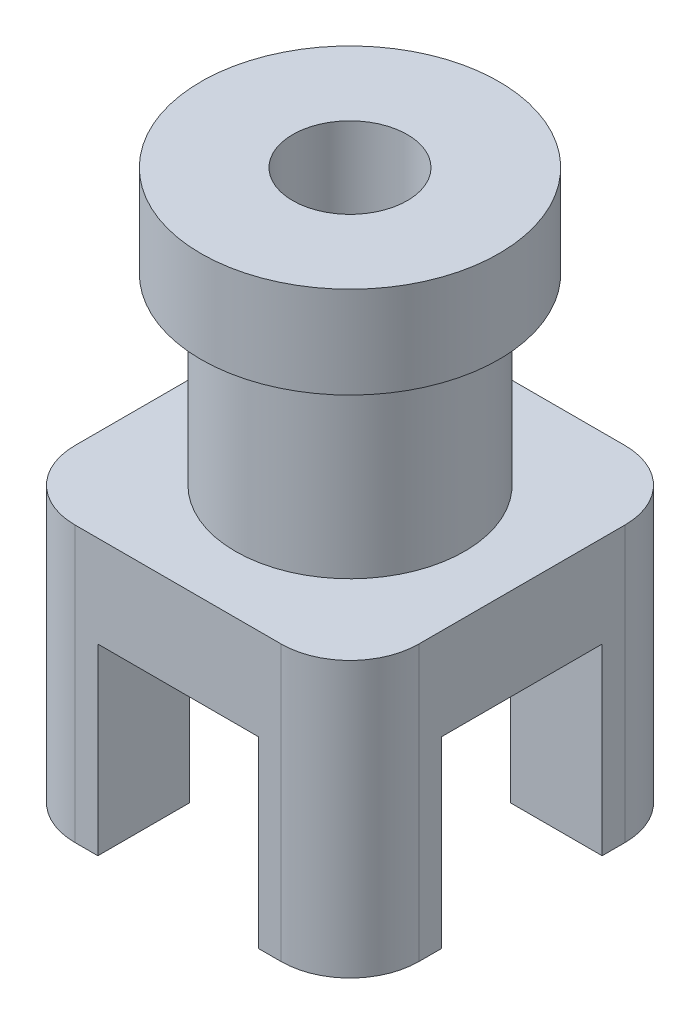
ISO-10303-21;
HEADER;
FILE_DESCRIPTION(('STEP AP214'),'2;1');
FILE_NAME('part.step','',(''),(''),'','','');
FILE_SCHEMA(('AUTOMOTIVE_DESIGN { 1 0 10303 214 1 1 1 1 }'));
ENDSEC;
DATA;
#1=APPLICATION_CONTEXT('core data for automotive mechanical design processes');
#2=APPLICATION_PROTOCOL_DEFINITION('international standard','automotive_design',2000,#1);
#3=PRODUCT_CONTEXT('',#1,'mechanical');
#4=PRODUCT('Part','Part','',(#3));
#5=PRODUCT_RELATED_PRODUCT_CATEGORY('part','',(#4));
#6=PRODUCT_DEFINITION_FORMATION('','',#4);
#7=PRODUCT_DEFINITION_CONTEXT('part definition',#1,'design');
#8=PRODUCT_DEFINITION('design','',#6,#7);
#9=PRODUCT_DEFINITION_SHAPE('','',#8);
#10=(LENGTH_UNIT() NAMED_UNIT(*) SI_UNIT(.MILLI.,.METRE.));
#11=(NAMED_UNIT(*) PLANE_ANGLE_UNIT() SI_UNIT($,.RADIAN.));
#12=(NAMED_UNIT(*) SI_UNIT($,.STERADIAN.) SOLID_ANGLE_UNIT());
#13=UNCERTAINTY_MEASURE_WITH_UNIT(LENGTH_MEASURE(1.E-05),#10,'distance_accuracy_value','');
#14=(GEOMETRIC_REPRESENTATION_CONTEXT(3) GLOBAL_UNCERTAINTY_ASSIGNED_CONTEXT((#13)) GLOBAL_UNIT_ASSIGNED_CONTEXT((#10,
#11,#12)) REPRESENTATION_CONTEXT('',''));
#15=CARTESIAN_POINT('',(0.,0.,0.));
#16=DIRECTION('',(0.,0.,1.));
#17=DIRECTION('',(1.,0.,0.));
#18=AXIS2_PLACEMENT_3D('',#15,#16,#17);
#19=CARTESIAN_POINT('',(0.,160.,0.));
#20=DIRECTION('',(0.,-1.,0.));
#21=DIRECTION('',(0.,0.,-1.));
#22=AXIS2_PLACEMENT_3D('',#19,#20,#21);
#23=CYLINDRICAL_SURFACE('',#22,50.);
#24=CARTESIAN_POINT('',(0.,40.,0.));
#25=DIRECTION('',(0.,1.,0.));
#26=DIRECTION('',(0.,0.,1.));
#27=AXIS2_PLACEMENT_3D('',#24,#25,#26);
#28=CIRCLE('',#27,50.);
#29=CARTESIAN_POINT('',(0.,40.,50.));
#30=VERTEX_POINT('',#29);
#31=EDGE_CURVE('E322',#30,#30,#28,.T.);
#32=ORIENTED_EDGE('',*,*,#31,.T.);
#33=EDGE_LOOP('',(#32));
#34=FACE_BOUND('',#33,.T.);
#35=CARTESIAN_POINT('',(0.,120.,0.));
#36=DIRECTION('',(0.,1.,0.));
#37=DIRECTION('',(0.,0.,1.));
#38=AXIS2_PLACEMENT_3D('',#35,#36,#37);
#39=CIRCLE('',#38,50.);
#40=CARTESIAN_POINT('',(0.,120.,50.));
#41=VERTEX_POINT('',#40);
#42=EDGE_CURVE('E11',#41,#41,#39,.T.);
#43=ORIENTED_EDGE('',*,*,#42,.F.);
#44=EDGE_LOOP('',(#43));
#45=FACE_BOUND('',#44,.T.);
#46=ADVANCED_FACE('F39',(#34,#45),#23,.T.);
#47=CARTESIAN_POINT('',(0.,-61.0000000000001,0.));
#48=DIRECTION('',(0.,1.,0.));
#49=DIRECTION('',(0.,0.,1.));
#50=AXIS2_PLACEMENT_3D('',#47,#48,#49);
#51=CYLINDRICAL_SURFACE('',#50,25.);
#52=CARTESIAN_POINT('',(0.,160.,0.));
#53=DIRECTION('',(0.,1.,0.));
#54=DIRECTION('',(0.,0.,1.));
#55=AXIS2_PLACEMENT_3D('',#52,#53,#54);
#56=CIRCLE('',#55,25.);
#57=CARTESIAN_POINT('',(0.,160.,25.));
#58=VERTEX_POINT('',#57);
#59=EDGE_CURVE('E727',#58,#58,#56,.T.);
#60=ORIENTED_EDGE('',*,*,#59,.T.);
#61=EDGE_LOOP('',(#60));
#62=FACE_BOUND('',#61,.T.);
#63=CARTESIAN_POINT('',(0.,0.,0.));
#64=DIRECTION('',(0.,-1.,0.));
#65=DIRECTION('',(0.,0.,-1.));
#66=AXIS2_PLACEMENT_3D('',#63,#64,#65);
#67=CIRCLE('',#66,25.);
#68=CARTESIAN_POINT('',(0.,0.,-25.));
#69=VERTEX_POINT('',#68);
#70=EDGE_CURVE('E710',#69,#69,#67,.T.);
#71=ORIENTED_EDGE('',*,*,#70,.T.);
#72=EDGE_LOOP('',(#71));
#73=FACE_BOUND('',#72,.T.);
#74=ADVANCED_FACE('F420',(#62,#73),#51,.F.);
#75=CARTESIAN_POINT('',(0.,0.,0.));
#76=DIRECTION('',(0.,-1.,0.));
#77=DIRECTION('',(0.,0.,-1.));
#78=AXIS2_PLACEMENT_3D('',#75,#76,#77);
#79=PLANE('',#78);
#80=ORIENTED_EDGE('',*,*,#70,.F.);
#81=EDGE_LOOP('',(#80));
#82=FACE_BOUND('',#81,.T.);
#83=DIRECTION('',(0.,0.,-1.));
#84=VECTOR('',#83,1.);
#85=CARTESIAN_POINT('',(35.,0.,-75.));
#86=LINE('',#85,#84);
#87=CARTESIAN_POINT('',(35.,0.,-35.));
#88=VERTEX_POINT('',#87);
#89=CARTESIAN_POINT('',(35.,0.,-75.));
#90=VERTEX_POINT('',#89);
#91=EDGE_CURVE('E188',#88,#90,#86,.T.);
#92=ORIENTED_EDGE('',*,*,#91,.F.);
#93=DIRECTION('',(-1.,0.,0.));
#94=VECTOR('',#93,1.);
#95=CARTESIAN_POINT('',(75.,0.,-35.));
#96=LINE('',#95,#94);
#97=CARTESIAN_POINT('',(75.,0.,-35.));
#98=VERTEX_POINT('',#97);
#99=EDGE_CURVE('E707',#98,#88,#96,.T.);
#100=ORIENTED_EDGE('',*,*,#99,.F.);
#101=DIRECTION('',(0.,0.,-1.));
#102=VECTOR('',#101,1.);
#103=CARTESIAN_POINT('',(75.,0.,-75.));
#104=LINE('',#103,#102);
#105=CARTESIAN_POINT('',(75.,0.,35.));
#106=VERTEX_POINT('',#105);
#107=EDGE_CURVE('E204',#106,#98,#104,.T.);
#108=ORIENTED_EDGE('',*,*,#107,.F.);
#109=DIRECTION('',(1.,0.,0.));
#110=VECTOR('',#109,1.);
#111=CARTESIAN_POINT('',(75.,0.,35.));
#112=LINE('',#111,#110);
#113=CARTESIAN_POINT('',(35.,0.,35.));
#114=VERTEX_POINT('',#113);
#115=EDGE_CURVE('E248',#114,#106,#112,.T.);
#116=ORIENTED_EDGE('',*,*,#115,.F.);
#117=DIRECTION('',(0.,0.,-1.));
#118=VECTOR('',#117,1.);
#119=CARTESIAN_POINT('',(35.,0.,75.));
#120=LINE('',#119,#118);
#121=CARTESIAN_POINT('',(35.,0.,75.));
#122=VERTEX_POINT('',#121);
#123=EDGE_CURVE('E243',#122,#114,#120,.T.);
#124=ORIENTED_EDGE('',*,*,#123,.F.);
#125=DIRECTION('',(1.,0.,0.));
#126=VECTOR('',#125,1.);
#127=CARTESIAN_POINT('',(75.,0.,75.));
#128=LINE('',#127,#126);
#129=CARTESIAN_POINT('',(-35.,0.,75.));
#130=VERTEX_POINT('',#129);
#131=EDGE_CURVE('E325',#130,#122,#128,.T.);
#132=ORIENTED_EDGE('',*,*,#131,.F.);
#133=DIRECTION('',(0.,0.,1.));
#134=VECTOR('',#133,1.);
#135=CARTESIAN_POINT('',(-35.,0.,75.));
#136=LINE('',#135,#134);
#137=CARTESIAN_POINT('',(-35.,0.,35.));
#138=VERTEX_POINT('',#137);
#139=EDGE_CURVE('E276',#138,#130,#136,.T.);
#140=ORIENTED_EDGE('',*,*,#139,.F.);
#141=DIRECTION('',(1.,0.,0.));
#142=VECTOR('',#141,1.);
#143=CARTESIAN_POINT('',(-75.,0.,35.));
#144=LINE('',#143,#142);
#145=CARTESIAN_POINT('',(-75.,0.,35.));
#146=VERTEX_POINT('',#145);
#147=EDGE_CURVE('E271',#146,#138,#144,.T.);
#148=ORIENTED_EDGE('',*,*,#147,.F.);
#149=DIRECTION('',(0.,0.,1.));
#150=VECTOR('',#149,1.);
#151=CARTESIAN_POINT('',(-75.,0.,-75.));
#152=LINE('',#151,#150);
#153=CARTESIAN_POINT('',(-75.,0.,-35.));
#154=VERTEX_POINT('',#153);
#155=EDGE_CURVE('E304',#154,#146,#152,.T.);
#156=ORIENTED_EDGE('',*,*,#155,.F.);
#157=DIRECTION('',(-1.,0.,0.));
#158=VECTOR('',#157,1.);
#159=CARTESIAN_POINT('',(-75.,0.,-35.));
#160=LINE('',#159,#158);
#161=CARTESIAN_POINT('',(-35.,0.,-35.));
#162=VERTEX_POINT('',#161);
#163=EDGE_CURVE('E210',#162,#154,#160,.T.);
#164=ORIENTED_EDGE('',*,*,#163,.F.);
#165=DIRECTION('',(0.,0.,1.));
#166=VECTOR('',#165,1.);
#167=CARTESIAN_POINT('',(-35.,0.,-75.));
#168=LINE('',#167,#166);
#169=CARTESIAN_POINT('',(-35.,0.,-75.));
#170=VERTEX_POINT('',#169);
#171=EDGE_CURVE('E206',#170,#162,#168,.T.);
#172=ORIENTED_EDGE('',*,*,#171,.F.);
#173=DIRECTION('',(-1.,0.,0.));
#174=VECTOR('',#173,1.);
#175=CARTESIAN_POINT('',(75.,0.,-75.));
#176=LINE('',#175,#174);
#177=EDGE_CURVE('E310',#90,#170,#176,.T.);
#178=ORIENTED_EDGE('',*,*,#177,.F.);
#179=EDGE_LOOP('',(#92,#100,#108,#116,#124,#132,#140,#148,#156,#164,#172,#178));
#180=FACE_BOUND('',#179,.T.);
#181=ADVANCED_FACE('F404',(#82,#180),#79,.T.);
#182=CARTESIAN_POINT('',(-75.,40.,-75.));
#183=DIRECTION('',(1.,0.,0.));
#184=DIRECTION('',(0.,0.,-1.));
#185=AXIS2_PLACEMENT_3D('',#182,#183,#184);
#186=PLANE('',#185);
#187=DIRECTION('',(0.,0.,1.));
#188=VECTOR('',#187,1.);
#189=CARTESIAN_POINT('',(-75.,40.,-75.));
#190=LINE('',#189,#188);
#191=CARTESIAN_POINT('',(-75.,40.,-45.));
#192=VERTEX_POINT('',#191);
#193=CARTESIAN_POINT('',(-75.,40.,45.));
#194=VERTEX_POINT('',#193);
#195=EDGE_CURVE('E305',#192,#194,#190,.T.);
#196=ORIENTED_EDGE('',*,*,#195,.F.);
#197=DIRECTION('',(0.,-1.,0.));
#198=VECTOR('',#197,1.);
#199=CARTESIAN_POINT('',(-75.,40.,-45.));
#200=LINE('',#199,#198);
#201=CARTESIAN_POINT('',(-75.,-80.,-45.));
#202=VERTEX_POINT('',#201);
#203=EDGE_CURVE('E336',#192,#202,#200,.T.);
#204=ORIENTED_EDGE('',*,*,#203,.T.);
#205=DIRECTION('',(0.,0.,-1.));
#206=VECTOR('',#205,1.);
#207=CARTESIAN_POINT('',(-75.,-80.,-75.));
#208=LINE('',#207,#206);
#209=CARTESIAN_POINT('',(-75.,-80.,-35.));
#210=VERTEX_POINT('',#209);
#211=EDGE_CURVE('E216',#210,#202,#208,.T.);
#212=ORIENTED_EDGE('',*,*,#211,.F.);
#213=DIRECTION('',(0.,1.,0.));
#214=VECTOR('',#213,1.);
#215=CARTESIAN_POINT('',(-75.,-80.,-35.));
#216=LINE('',#215,#214);
#217=EDGE_CURVE('E228',#210,#154,#216,.T.);
#218=ORIENTED_EDGE('',*,*,#217,.T.);
#219=ORIENTED_EDGE('',*,*,#155,.T.);
#220=DIRECTION('',(0.,1.,0.));
#221=VECTOR('',#220,1.);
#222=CARTESIAN_POINT('',(-75.,-80.,35.));
#223=LINE('',#222,#221);
#224=CARTESIAN_POINT('',(-75.,-80.,35.));
#225=VERTEX_POINT('',#224);
#226=EDGE_CURVE('E300',#225,#146,#223,.T.);
#227=ORIENTED_EDGE('',*,*,#226,.F.);
#228=DIRECTION('',(0.,0.,-1.));
#229=VECTOR('',#228,1.);
#230=CARTESIAN_POINT('',(-75.,-80.,75.));
#231=LINE('',#230,#229);
#232=CARTESIAN_POINT('',(-75.,-80.,45.));
#233=VERTEX_POINT('',#232);
#234=EDGE_CURVE('E272',#233,#225,#231,.T.);
#235=ORIENTED_EDGE('',*,*,#234,.F.);
#236=DIRECTION('',(0.,-1.,0.));
#237=VECTOR('',#236,1.);
#238=CARTESIAN_POINT('',(-75.,40.,45.));
#239=LINE('',#238,#237);
#240=EDGE_CURVE('E333',#233,#194,#239,.F.);
#241=ORIENTED_EDGE('',*,*,#240,.T.);
#242=EDGE_LOOP('',(#196,#204,#212,#218,#219,#227,#235,#241));
#243=FACE_BOUND('',#242,.T.);
#244=ADVANCED_FACE('F389',(#243),#186,.F.);
#245=CARTESIAN_POINT('',(75.,40.,75.));
#246=DIRECTION('',(0.,0.,-1.));
#247=DIRECTION('',(-1.,0.,0.));
#248=AXIS2_PLACEMENT_3D('',#245,#246,#247);
#249=PLANE('',#248);
#250=DIRECTION('',(-1.,0.,0.));
#251=VECTOR('',#250,1.);
#252=CARTESIAN_POINT('',(75.,-80.,75.));
#253=LINE('',#252,#251);
#254=CARTESIAN_POINT('',(45.,-80.,75.));
#255=VERTEX_POINT('',#254);
#256=CARTESIAN_POINT('',(35.,-80.,75.));
#257=VERTEX_POINT('',#256);
#258=EDGE_CURVE('E247',#255,#257,#253,.T.);
#259=ORIENTED_EDGE('',*,*,#258,.F.);
#260=DIRECTION('',(0.,-1.,0.));
#261=VECTOR('',#260,1.);
#262=CARTESIAN_POINT('',(45.,40.,75.));
#263=LINE('',#262,#261);
#264=CARTESIAN_POINT('',(45.,40.,75.));
#265=VERTEX_POINT('',#264);
#266=EDGE_CURVE('E375',#255,#265,#263,.F.);
#267=ORIENTED_EDGE('',*,*,#266,.T.);
#268=DIRECTION('',(1.,0.,0.));
#269=VECTOR('',#268,1.);
#270=CARTESIAN_POINT('',(75.,40.,75.));
#271=LINE('',#270,#269);
#272=CARTESIAN_POINT('',(-45.,40.,75.));
#273=VERTEX_POINT('',#272);
#274=EDGE_CURVE('E309',#273,#265,#271,.T.);
#275=ORIENTED_EDGE('',*,*,#274,.F.);
#276=DIRECTION('',(0.,-1.,0.));
#277=VECTOR('',#276,1.);
#278=CARTESIAN_POINT('',(-45.,40.,75.));
#279=LINE('',#278,#277);
#280=CARTESIAN_POINT('',(-45.,-80.,75.));
#281=VERTEX_POINT('',#280);
#282=EDGE_CURVE('E373',#273,#281,#279,.T.);
#283=ORIENTED_EDGE('',*,*,#282,.T.);
#284=DIRECTION('',(-1.,0.,0.));
#285=VECTOR('',#284,1.);
#286=CARTESIAN_POINT('',(-75.,-80.,75.));
#287=LINE('',#286,#285);
#288=CARTESIAN_POINT('',(-35.,-80.,75.));
#289=VERTEX_POINT('',#288);
#290=EDGE_CURVE('E282',#289,#281,#287,.T.);
#291=ORIENTED_EDGE('',*,*,#290,.F.);
#292=DIRECTION('',(0.,1.,0.));
#293=VECTOR('',#292,1.);
#294=CARTESIAN_POINT('',(-35.,-80.,75.));
#295=LINE('',#294,#293);
#296=EDGE_CURVE('E286',#289,#130,#295,.T.);
#297=ORIENTED_EDGE('',*,*,#296,.T.);
#298=ORIENTED_EDGE('',*,*,#131,.T.);
#299=DIRECTION('',(0.,1.,0.));
#300=VECTOR('',#299,1.);
#301=CARTESIAN_POINT('',(35.,-80.,75.));
#302=LINE('',#301,#300);
#303=EDGE_CURVE('E268',#257,#122,#302,.T.);
#304=ORIENTED_EDGE('',*,*,#303,.F.);
#305=EDGE_LOOP('',(#259,#267,#275,#283,#291,#297,#298,#304));
#306=FACE_BOUND('',#305,.T.);
#307=ADVANCED_FACE('F394',(#306),#249,.F.);
#308=CARTESIAN_POINT('',(75.,40.,-75.));
#309=DIRECTION('',(-1.,0.,0.));
#310=DIRECTION('',(0.,0.,1.));
#311=AXIS2_PLACEMENT_3D('',#308,#309,#310);
#312=PLANE('',#311);
#313=DIRECTION('',(0.,0.,1.));
#314=VECTOR('',#313,1.);
#315=CARTESIAN_POINT('',(75.,-80.,-75.));
#316=LINE('',#315,#314);
#317=CARTESIAN_POINT('',(75.,-80.,-45.));
#318=VERTEX_POINT('',#317);
#319=CARTESIAN_POINT('',(75.,-80.,-35.));
#320=VERTEX_POINT('',#319);
#321=EDGE_CURVE('E177',#318,#320,#316,.T.);
#322=ORIENTED_EDGE('',*,*,#321,.F.);
#323=DIRECTION('',(0.,-1.,0.));
#324=VECTOR('',#323,1.);
#325=CARTESIAN_POINT('',(75.,40.,-45.));
#326=LINE('',#325,#324);
#327=CARTESIAN_POINT('',(75.,40.,-45.));
#328=VERTEX_POINT('',#327);
#329=EDGE_CURVE('E368',#318,#328,#326,.F.);
#330=ORIENTED_EDGE('',*,*,#329,.T.);
#331=DIRECTION('',(0.,0.,-1.));
#332=VECTOR('',#331,1.);
#333=CARTESIAN_POINT('',(75.,40.,-75.));
#334=LINE('',#333,#332);
#335=CARTESIAN_POINT('',(75.,40.,45.));
#336=VERTEX_POINT('',#335);
#337=EDGE_CURVE('E314',#336,#328,#334,.T.);
#338=ORIENTED_EDGE('',*,*,#337,.F.);
#339=DIRECTION('',(0.,-1.,0.));
#340=VECTOR('',#339,1.);
#341=CARTESIAN_POINT('',(75.,40.,45.));
#342=LINE('',#341,#340);
#343=CARTESIAN_POINT('',(75.,-80.,45.));
#344=VERTEX_POINT('',#343);
#345=EDGE_CURVE('E364',#336,#344,#342,.T.);
#346=ORIENTED_EDGE('',*,*,#345,.T.);
#347=DIRECTION('',(0.,0.,1.));
#348=VECTOR('',#347,1.);
#349=CARTESIAN_POINT('',(75.,-80.,75.));
#350=LINE('',#349,#348);
#351=CARTESIAN_POINT('',(75.,-80.,35.));
#352=VERTEX_POINT('',#351);
#353=EDGE_CURVE('E244',#352,#344,#350,.T.);
#354=ORIENTED_EDGE('',*,*,#353,.F.);
#355=DIRECTION('',(0.,1.,0.));
#356=VECTOR('',#355,1.);
#357=CARTESIAN_POINT('',(75.,-80.,35.));
#358=LINE('',#357,#356);
#359=EDGE_CURVE('E257',#352,#106,#358,.T.);
#360=ORIENTED_EDGE('',*,*,#359,.T.);
#361=ORIENTED_EDGE('',*,*,#107,.T.);
#362=DIRECTION('',(0.,1.,0.));
#363=VECTOR('',#362,1.);
#364=CARTESIAN_POINT('',(75.,-80.,-35.));
#365=LINE('',#364,#363);
#366=EDGE_CURVE('E192',#320,#98,#365,.T.);
#367=ORIENTED_EDGE('',*,*,#366,.F.);
#368=EDGE_LOOP('',(#322,#330,#338,#346,#354,#360,#361,#367));
#369=FACE_BOUND('',#368,.T.);
#370=ADVANCED_FACE('F201',(#369),#312,.F.);
#371=CARTESIAN_POINT('',(75.,40.,-75.));
#372=DIRECTION('',(0.,0.,1.));
#373=DIRECTION('',(1.,0.,0.));
#374=AXIS2_PLACEMENT_3D('',#371,#372,#373);
#375=PLANE('',#374);
#376=DIRECTION('',(1.,0.,0.));
#377=VECTOR('',#376,1.);
#378=CARTESIAN_POINT('',(-75.,-80.,-75.));
#379=LINE('',#378,#377);
#380=CARTESIAN_POINT('',(-45.,-80.,-75.));
#381=VERTEX_POINT('',#380);
#382=CARTESIAN_POINT('',(-35.,-80.,-75.));
#383=VERTEX_POINT('',#382);
#384=EDGE_CURVE('E220',#381,#383,#379,.T.);
#385=ORIENTED_EDGE('',*,*,#384,.F.);
#386=DIRECTION('',(0.,-1.,0.));
#387=VECTOR('',#386,1.);
#388=CARTESIAN_POINT('',(-45.,40.,-75.));
#389=LINE('',#388,#387);
#390=CARTESIAN_POINT('',(-45.,40.,-75.));
#391=VERTEX_POINT('',#390);
#392=EDGE_CURVE('E347',#381,#391,#389,.F.);
#393=ORIENTED_EDGE('',*,*,#392,.T.);
#394=DIRECTION('',(-1.,0.,0.));
#395=VECTOR('',#394,1.);
#396=CARTESIAN_POINT('',(75.,40.,-75.));
#397=LINE('',#396,#395);
#398=CARTESIAN_POINT('',(45.,40.,-75.));
#399=VERTEX_POINT('',#398);
#400=EDGE_CURVE('E318',#399,#391,#397,.T.);
#401=ORIENTED_EDGE('',*,*,#400,.F.);
#402=DIRECTION('',(0.,-1.,0.));
#403=VECTOR('',#402,1.);
#404=CARTESIAN_POINT('',(45.,40.,-75.));
#405=LINE('',#404,#403);
#406=CARTESIAN_POINT('',(45.,-80.,-75.));
#407=VERTEX_POINT('',#406);
#408=EDGE_CURVE('E343',#399,#407,#405,.T.);
#409=ORIENTED_EDGE('',*,*,#408,.T.);
#410=DIRECTION('',(1.,0.,0.));
#411=VECTOR('',#410,1.);
#412=CARTESIAN_POINT('',(75.,-80.,-75.));
#413=LINE('',#412,#411);
#414=CARTESIAN_POINT('',(35.,-80.,-75.));
#415=VERTEX_POINT('',#414);
#416=EDGE_CURVE('E704',#415,#407,#413,.T.);
#417=ORIENTED_EDGE('',*,*,#416,.F.);
#418=DIRECTION('',(0.,1.,0.));
#419=VECTOR('',#418,1.);
#420=CARTESIAN_POINT('',(35.,-80.,-75.));
#421=LINE('',#420,#419);
#422=EDGE_CURVE('E212',#415,#90,#421,.T.);
#423=ORIENTED_EDGE('',*,*,#422,.T.);
#424=ORIENTED_EDGE('',*,*,#177,.T.);
#425=DIRECTION('',(0.,1.,0.));
#426=VECTOR('',#425,1.);
#427=CARTESIAN_POINT('',(-35.,-80.,-75.));
#428=LINE('',#427,#426);
#429=EDGE_CURVE('E239',#383,#170,#428,.T.);
#430=ORIENTED_EDGE('',*,*,#429,.F.);
#431=EDGE_LOOP('',(#385,#393,#401,#409,#417,#423,#424,#430));
#432=FACE_BOUND('',#431,.T.);
#433=ADVANCED_FACE('F416',(#432),#375,.F.);
#434=CARTESIAN_POINT('',(0.,40.,0.));
#435=DIRECTION('',(0.,-1.,0.));
#436=DIRECTION('',(0.,0.,-1.));
#437=AXIS2_PLACEMENT_3D('',#434,#435,#436);
#438=PLANE('',#437);
#439=ORIENTED_EDGE('',*,*,#31,.F.);
#440=EDGE_LOOP('',(#439));
#441=FACE_BOUND('',#440,.T.);
#442=ORIENTED_EDGE('',*,*,#400,.T.);
#443=CARTESIAN_POINT('',(-45.,40.,-45.));
#444=DIRECTION('',(0.,-1.,0.));
#445=DIRECTION('',(0.,0.,-1.));
#446=AXIS2_PLACEMENT_3D('',#443,#444,#445);
#447=CIRCLE('',#446,30.);
#448=EDGE_CURVE('E359',#391,#192,#447,.F.);
#449=ORIENTED_EDGE('',*,*,#448,.T.);
#450=ORIENTED_EDGE('',*,*,#195,.T.);
#451=CARTESIAN_POINT('',(-45.,40.,45.));
#452=DIRECTION('',(0.,-1.,0.));
#453=DIRECTION('',(0.,0.,-1.));
#454=AXIS2_PLACEMENT_3D('',#451,#452,#453);
#455=CIRCLE('',#454,30.);
#456=EDGE_CURVE('E350',#194,#273,#455,.F.);
#457=ORIENTED_EDGE('',*,*,#456,.T.);
#458=ORIENTED_EDGE('',*,*,#274,.T.);
#459=CARTESIAN_POINT('',(45.,40.,45.));
#460=DIRECTION('',(0.,-1.,0.));
#461=DIRECTION('',(0.,0.,-1.));
#462=AXIS2_PLACEMENT_3D('',#459,#460,#461);
#463=CIRCLE('',#462,30.);
#464=EDGE_CURVE('E353',#265,#336,#463,.F.);
#465=ORIENTED_EDGE('',*,*,#464,.T.);
#466=ORIENTED_EDGE('',*,*,#337,.T.);
#467=CARTESIAN_POINT('',(45.,40.,-45.));
#468=DIRECTION('',(0.,-1.,0.));
#469=DIRECTION('',(0.,0.,-1.));
#470=AXIS2_PLACEMENT_3D('',#467,#468,#469);
#471=CIRCLE('',#470,30.);
#472=EDGE_CURVE('E356',#328,#399,#471,.F.);
#473=ORIENTED_EDGE('',*,*,#472,.T.);
#474=EDGE_LOOP('',(#442,#449,#450,#457,#458,#465,#466,#473));
#475=FACE_BOUND('',#474,.T.);
#476=ADVANCED_FACE('F392',(#441,#475),#438,.F.);
#477=CARTESIAN_POINT('',(-75.,-80.,35.));
#478=DIRECTION('',(0.,0.,1.));
#479=DIRECTION('',(1.,0.,0.));
#480=AXIS2_PLACEMENT_3D('',#477,#478,#479);
#481=PLANE('',#480);
#482=ORIENTED_EDGE('',*,*,#147,.T.);
#483=DIRECTION('',(0.,1.,0.));
#484=VECTOR('',#483,1.);
#485=CARTESIAN_POINT('',(-35.,-80.,35.));
#486=LINE('',#485,#484);
#487=CARTESIAN_POINT('',(-35.,-80.,35.));
#488=VERTEX_POINT('',#487);
#489=EDGE_CURVE('E296',#488,#138,#486,.T.);
#490=ORIENTED_EDGE('',*,*,#489,.F.);
#491=DIRECTION('',(1.,0.,0.));
#492=VECTOR('',#491,1.);
#493=CARTESIAN_POINT('',(-75.,-80.,35.));
#494=LINE('',#493,#492);
#495=EDGE_CURVE('E275',#225,#488,#494,.T.);
#496=ORIENTED_EDGE('',*,*,#495,.F.);
#497=ORIENTED_EDGE('',*,*,#226,.T.);
#498=EDGE_LOOP('',(#482,#490,#496,#497));
#499=FACE_BOUND('',#498,.T.);
#500=ADVANCED_FACE('F408',(#499),#481,.F.);
#501=CARTESIAN_POINT('',(-35.,-80.,75.));
#502=DIRECTION('',(-1.,0.,0.));
#503=DIRECTION('',(0.,0.,1.));
#504=AXIS2_PLACEMENT_3D('',#501,#502,#503);
#505=PLANE('',#504);
#506=ORIENTED_EDGE('',*,*,#139,.T.);
#507=ORIENTED_EDGE('',*,*,#296,.F.);
#508=DIRECTION('',(0.,0.,1.));
#509=VECTOR('',#508,1.);
#510=CARTESIAN_POINT('',(-35.,-80.,75.));
#511=LINE('',#510,#509);
#512=EDGE_CURVE('E279',#488,#289,#511,.T.);
#513=ORIENTED_EDGE('',*,*,#512,.F.);
#514=ORIENTED_EDGE('',*,*,#489,.T.);
#515=EDGE_LOOP('',(#506,#507,#513,#514));
#516=FACE_BOUND('',#515,.T.);
#517=ADVANCED_FACE('F399',(#516),#505,.F.);
#518=CARTESIAN_POINT('',(0.,-80.,0.));
#519=DIRECTION('',(0.,-1.,0.));
#520=DIRECTION('',(0.,0.,-1.));
#521=AXIS2_PLACEMENT_3D('',#518,#519,#520);
#522=PLANE('',#521);
#523=ORIENTED_EDGE('',*,*,#290,.T.);
#524=CARTESIAN_POINT('',(-45.,-80.,45.));
#525=DIRECTION('',(0.,-1.,0.));
#526=DIRECTION('',(0.,0.,-1.));
#527=AXIS2_PLACEMENT_3D('',#524,#525,#526);
#528=CIRCLE('',#527,30.);
#529=EDGE_CURVE('E43',#281,#233,#528,.T.);
#530=ORIENTED_EDGE('',*,*,#529,.T.);
#531=ORIENTED_EDGE('',*,*,#234,.T.);
#532=ORIENTED_EDGE('',*,*,#495,.T.);
#533=ORIENTED_EDGE('',*,*,#512,.T.);
#534=EDGE_LOOP('',(#523,#530,#531,#532,#533));
#535=FACE_BOUND('',#534,.T.);
#536=ADVANCED_FACE('F383',(#535),#522,.T.);
#537=CARTESIAN_POINT('',(35.,-80.,75.));
#538=DIRECTION('',(1.,0.,0.));
#539=DIRECTION('',(0.,0.,-1.));
#540=AXIS2_PLACEMENT_3D('',#537,#538,#539);
#541=PLANE('',#540);
#542=ORIENTED_EDGE('',*,*,#123,.T.);
#543=DIRECTION('',(0.,1.,0.));
#544=VECTOR('',#543,1.);
#545=CARTESIAN_POINT('',(35.,-80.,35.));
#546=LINE('',#545,#544);
#547=CARTESIAN_POINT('',(35.,-80.,35.));
#548=VERTEX_POINT('',#547);
#549=EDGE_CURVE('E265',#548,#114,#546,.T.);
#550=ORIENTED_EDGE('',*,*,#549,.F.);
#551=DIRECTION('',(0.,0.,-1.));
#552=VECTOR('',#551,1.);
#553=CARTESIAN_POINT('',(35.,-80.,75.));
#554=LINE('',#553,#552);
#555=EDGE_CURVE('E251',#257,#548,#554,.T.);
#556=ORIENTED_EDGE('',*,*,#555,.F.);
#557=ORIENTED_EDGE('',*,*,#303,.T.);
#558=EDGE_LOOP('',(#542,#550,#556,#557));
#559=FACE_BOUND('',#558,.T.);
#560=ADVANCED_FACE('F460',(#559),#541,.F.);
#561=CARTESIAN_POINT('',(75.,-80.,35.));
#562=DIRECTION('',(0.,0.,1.));
#563=DIRECTION('',(1.,0.,0.));
#564=AXIS2_PLACEMENT_3D('',#561,#562,#563);
#565=PLANE('',#564);
#566=ORIENTED_EDGE('',*,*,#115,.T.);
#567=ORIENTED_EDGE('',*,*,#359,.F.);
#568=DIRECTION('',(1.,0.,0.));
#569=VECTOR('',#568,1.);
#570=CARTESIAN_POINT('',(75.,-80.,35.));
#571=LINE('',#570,#569);
#572=EDGE_CURVE('E254',#548,#352,#571,.T.);
#573=ORIENTED_EDGE('',*,*,#572,.F.);
#574=ORIENTED_EDGE('',*,*,#549,.T.);
#575=EDGE_LOOP('',(#566,#567,#573,#574));
#576=FACE_BOUND('',#575,.T.);
#577=ADVANCED_FACE('F457',(#576),#565,.F.);
#578=CARTESIAN_POINT('',(0.,-80.,0.));
#579=DIRECTION('',(0.,1.,0.));
#580=DIRECTION('',(0.,0.,1.));
#581=AXIS2_PLACEMENT_3D('',#578,#579,#580);
#582=PLANE('',#581);
#583=ORIENTED_EDGE('',*,*,#353,.T.);
#584=CARTESIAN_POINT('',(45.,-80.,45.));
#585=DIRECTION('',(0.,1.,0.));
#586=DIRECTION('',(0.,0.,1.));
#587=AXIS2_PLACEMENT_3D('',#584,#585,#586);
#588=CIRCLE('',#587,30.);
#589=EDGE_CURVE('E63',#344,#255,#588,.F.);
#590=ORIENTED_EDGE('',*,*,#589,.T.);
#591=ORIENTED_EDGE('',*,*,#258,.T.);
#592=ORIENTED_EDGE('',*,*,#555,.T.);
#593=ORIENTED_EDGE('',*,*,#572,.T.);
#594=EDGE_LOOP('',(#583,#590,#591,#592,#593));
#595=FACE_BOUND('',#594,.T.);
#596=ADVANCED_FACE('F453',(#595),#582,.F.);
#597=CARTESIAN_POINT('',(-35.,-80.,-75.));
#598=DIRECTION('',(-1.,0.,0.));
#599=DIRECTION('',(0.,0.,1.));
#600=AXIS2_PLACEMENT_3D('',#597,#598,#599);
#601=PLANE('',#600);
#602=ORIENTED_EDGE('',*,*,#171,.T.);
#603=DIRECTION('',(0.,1.,0.));
#604=VECTOR('',#603,1.);
#605=CARTESIAN_POINT('',(-35.,-80.,-35.));
#606=LINE('',#605,#604);
#607=CARTESIAN_POINT('',(-35.,-80.,-35.));
#608=VERTEX_POINT('',#607);
#609=EDGE_CURVE('E235',#608,#162,#606,.T.);
#610=ORIENTED_EDGE('',*,*,#609,.F.);
#611=DIRECTION('',(0.,0.,1.));
#612=VECTOR('',#611,1.);
#613=CARTESIAN_POINT('',(-35.,-80.,-75.));
#614=LINE('',#613,#612);
#615=EDGE_CURVE('E223',#383,#608,#614,.T.);
#616=ORIENTED_EDGE('',*,*,#615,.F.);
#617=ORIENTED_EDGE('',*,*,#429,.T.);
#618=EDGE_LOOP('',(#602,#610,#616,#617));
#619=FACE_BOUND('',#618,.T.);
#620=ADVANCED_FACE('F449',(#619),#601,.F.);
#621=CARTESIAN_POINT('',(-75.,-80.,-35.));
#622=DIRECTION('',(0.,0.,-1.));
#623=DIRECTION('',(-1.,0.,0.));
#624=AXIS2_PLACEMENT_3D('',#621,#622,#623);
#625=PLANE('',#624);
#626=ORIENTED_EDGE('',*,*,#163,.T.);
#627=ORIENTED_EDGE('',*,*,#217,.F.);
#628=DIRECTION('',(-1.,0.,0.));
#629=VECTOR('',#628,1.);
#630=CARTESIAN_POINT('',(-75.,-80.,-35.));
#631=LINE('',#630,#629);
#632=EDGE_CURVE('E226',#608,#210,#631,.T.);
#633=ORIENTED_EDGE('',*,*,#632,.F.);
#634=ORIENTED_EDGE('',*,*,#609,.T.);
#635=EDGE_LOOP('',(#626,#627,#633,#634));
#636=FACE_BOUND('',#635,.T.);
#637=ADVANCED_FACE('F445',(#636),#625,.F.);
#638=CARTESIAN_POINT('',(0.,-80.,0.));
#639=DIRECTION('',(0.,1.,0.));
#640=DIRECTION('',(0.,0.,1.));
#641=AXIS2_PLACEMENT_3D('',#638,#639,#640);
#642=PLANE('',#641);
#643=ORIENTED_EDGE('',*,*,#211,.T.);
#644=CARTESIAN_POINT('',(-45.,-80.,-45.));
#645=DIRECTION('',(0.,1.,0.));
#646=DIRECTION('',(0.,0.,1.));
#647=AXIS2_PLACEMENT_3D('',#644,#645,#646);
#648=CIRCLE('',#647,30.);
#649=EDGE_CURVE('E340',#202,#381,#648,.F.);
#650=ORIENTED_EDGE('',*,*,#649,.T.);
#651=ORIENTED_EDGE('',*,*,#384,.T.);
#652=ORIENTED_EDGE('',*,*,#615,.T.);
#653=ORIENTED_EDGE('',*,*,#632,.T.);
#654=EDGE_LOOP('',(#643,#650,#651,#652,#653));
#655=FACE_BOUND('',#654,.T.);
#656=ADVANCED_FACE('F442',(#655),#642,.F.);
#657=CARTESIAN_POINT('',(75.,-80.,-35.));
#658=DIRECTION('',(0.,0.,-1.));
#659=DIRECTION('',(-1.,0.,0.));
#660=AXIS2_PLACEMENT_3D('',#657,#658,#659);
#661=PLANE('',#660);
#662=ORIENTED_EDGE('',*,*,#99,.T.);
#663=DIRECTION('',(0.,1.,0.));
#664=VECTOR('',#663,1.);
#665=CARTESIAN_POINT('',(35.,-80.,-35.));
#666=LINE('',#665,#664);
#667=CARTESIAN_POINT('',(35.,-80.,-35.));
#668=VERTEX_POINT('',#667);
#669=EDGE_CURVE('E195',#668,#88,#666,.T.);
#670=ORIENTED_EDGE('',*,*,#669,.F.);
#671=DIRECTION('',(-1.,0.,0.));
#672=VECTOR('',#671,1.);
#673=CARTESIAN_POINT('',(75.,-80.,-35.));
#674=LINE('',#673,#672);
#675=EDGE_CURVE('E181',#320,#668,#674,.T.);
#676=ORIENTED_EDGE('',*,*,#675,.F.);
#677=ORIENTED_EDGE('',*,*,#366,.T.);
#678=EDGE_LOOP('',(#662,#670,#676,#677));
#679=FACE_BOUND('',#678,.T.);
#680=ADVANCED_FACE('F191',(#679),#661,.F.);
#681=CARTESIAN_POINT('',(35.,-80.,-75.));
#682=DIRECTION('',(1.,0.,0.));
#683=DIRECTION('',(0.,0.,-1.));
#684=AXIS2_PLACEMENT_3D('',#681,#682,#683);
#685=PLANE('',#684);
#686=ORIENTED_EDGE('',*,*,#91,.T.);
#687=ORIENTED_EDGE('',*,*,#422,.F.);
#688=DIRECTION('',(0.,0.,-1.));
#689=VECTOR('',#688,1.);
#690=CARTESIAN_POINT('',(35.,-80.,-75.));
#691=LINE('',#690,#689);
#692=EDGE_CURVE('E198',#668,#415,#691,.T.);
#693=ORIENTED_EDGE('',*,*,#692,.F.);
#694=ORIENTED_EDGE('',*,*,#669,.T.);
#695=EDGE_LOOP('',(#686,#687,#693,#694));
#696=FACE_BOUND('',#695,.T.);
#697=ADVANCED_FACE('F436',(#696),#685,.F.);
#698=CARTESIAN_POINT('',(0.,-80.,0.));
#699=DIRECTION('',(0.,-1.,0.));
#700=DIRECTION('',(0.,0.,-1.));
#701=AXIS2_PLACEMENT_3D('',#698,#699,#700);
#702=PLANE('',#701);
#703=ORIENTED_EDGE('',*,*,#416,.T.);
#704=CARTESIAN_POINT('',(45.,-80.,-45.));
#705=DIRECTION('',(0.,-1.,0.));
#706=DIRECTION('',(0.,0.,-1.));
#707=AXIS2_PLACEMENT_3D('',#704,#705,#706);
#708=CIRCLE('',#707,30.);
#709=EDGE_CURVE('E183',#407,#318,#708,.T.);
#710=ORIENTED_EDGE('',*,*,#709,.T.);
#711=ORIENTED_EDGE('',*,*,#321,.T.);
#712=ORIENTED_EDGE('',*,*,#675,.T.);
#713=ORIENTED_EDGE('',*,*,#692,.T.);
#714=EDGE_LOOP('',(#703,#710,#711,#712,#713));
#715=FACE_BOUND('',#714,.T.);
#716=ADVANCED_FACE('F180',(#715),#702,.T.);
#717=CARTESIAN_POINT('',(-45.,40.,-45.));
#718=DIRECTION('',(0.,-1.,0.));
#719=DIRECTION('',(0.,0.,-1.));
#720=AXIS2_PLACEMENT_3D('',#717,#718,#719);
#721=CYLINDRICAL_SURFACE('',#720,30.);
#722=ORIENTED_EDGE('',*,*,#448,.F.);
#723=ORIENTED_EDGE('',*,*,#392,.F.);
#724=ORIENTED_EDGE('',*,*,#649,.F.);
#725=ORIENTED_EDGE('',*,*,#203,.F.);
#726=EDGE_LOOP('',(#722,#723,#724,#725));
#727=FACE_BOUND('',#726,.T.);
#728=ADVANCED_FACE('F435',(#727),#721,.T.);
#729=CARTESIAN_POINT('',(45.,40.,-45.));
#730=DIRECTION('',(0.,-1.,0.));
#731=DIRECTION('',(0.,0.,-1.));
#732=AXIS2_PLACEMENT_3D('',#729,#730,#731);
#733=CYLINDRICAL_SURFACE('',#732,30.);
#734=ORIENTED_EDGE('',*,*,#472,.F.);
#735=ORIENTED_EDGE('',*,*,#329,.F.);
#736=ORIENTED_EDGE('',*,*,#709,.F.);
#737=ORIENTED_EDGE('',*,*,#408,.F.);
#738=EDGE_LOOP('',(#734,#735,#736,#737));
#739=FACE_BOUND('',#738,.T.);
#740=ADVANCED_FACE('F514',(#739),#733,.T.);
#741=CARTESIAN_POINT('',(45.,40.,45.));
#742=DIRECTION('',(0.,-1.,0.));
#743=DIRECTION('',(0.,0.,-1.));
#744=AXIS2_PLACEMENT_3D('',#741,#742,#743);
#745=CYLINDRICAL_SURFACE('',#744,30.);
#746=ORIENTED_EDGE('',*,*,#464,.F.);
#747=ORIENTED_EDGE('',*,*,#266,.F.);
#748=ORIENTED_EDGE('',*,*,#589,.F.);
#749=ORIENTED_EDGE('',*,*,#345,.F.);
#750=EDGE_LOOP('',(#746,#747,#748,#749));
#751=FACE_BOUND('',#750,.T.);
#752=ADVANCED_FACE('F522',(#751),#745,.T.);
#753=CARTESIAN_POINT('',(-45.,40.,45.));
#754=DIRECTION('',(0.,-1.,0.));
#755=DIRECTION('',(0.,0.,-1.));
#756=AXIS2_PLACEMENT_3D('',#753,#754,#755);
#757=CYLINDRICAL_SURFACE('',#756,30.);
#758=ORIENTED_EDGE('',*,*,#456,.F.);
#759=ORIENTED_EDGE('',*,*,#240,.F.);
#760=ORIENTED_EDGE('',*,*,#529,.F.);
#761=ORIENTED_EDGE('',*,*,#282,.F.);
#762=EDGE_LOOP('',(#758,#759,#760,#761));
#763=FACE_BOUND('',#762,.T.);
#764=ADVANCED_FACE('F41',(#763),#757,.T.);
#765=CARTESIAN_POINT('',(0.,120.,0.));
#766=DIRECTION('',(0.,1.,0.));
#767=DIRECTION('',(0.,0.,1.));
#768=AXIS2_PLACEMENT_3D('',#765,#766,#767);
#769=PLANE('',#768);
#770=CARTESIAN_POINT('',(0.,120.,0.));
#771=DIRECTION('',(0.,1.,0.));
#772=DIRECTION('',(0.,0.,1.));
#773=AXIS2_PLACEMENT_3D('',#770,#771,#772);
#774=CIRCLE('',#773,65.);
#775=CARTESIAN_POINT('',(0.,120.,65.));
#776=VERTEX_POINT('',#775);
#777=EDGE_CURVE('E721',#776,#776,#774,.T.);
#778=ORIENTED_EDGE('',*,*,#777,.F.);
#779=EDGE_LOOP('',(#778));
#780=FACE_BOUND('',#779,.T.);
#781=ORIENTED_EDGE('',*,*,#42,.T.);
#782=EDGE_LOOP('',(#781));
#783=FACE_BOUND('',#782,.T.);
#784=ADVANCED_FACE('F536',(#780,#783),#769,.F.);
#785=CARTESIAN_POINT('',(0.,120.,0.));
#786=DIRECTION('',(0.,1.,0.));
#787=DIRECTION('',(0.,0.,1.));
#788=AXIS2_PLACEMENT_3D('',#785,#786,#787);
#789=CYLINDRICAL_SURFACE('',#788,65.);
#790=ORIENTED_EDGE('',*,*,#777,.T.);
#791=EDGE_LOOP('',(#790));
#792=FACE_BOUND('',#791,.T.);
#793=CARTESIAN_POINT('',(0.,160.,0.));
#794=DIRECTION('',(0.,1.,0.));
#795=DIRECTION('',(0.,0.,1.));
#796=AXIS2_PLACEMENT_3D('',#793,#794,#795);
#797=CIRCLE('',#796,65.);
#798=CARTESIAN_POINT('',(0.,160.,65.));
#799=VERTEX_POINT('',#798);
#800=EDGE_CURVE('E723',#799,#799,#797,.T.);
#801=ORIENTED_EDGE('',*,*,#800,.F.);
#802=EDGE_LOOP('',(#801));
#803=FACE_BOUND('',#802,.T.);
#804=ADVANCED_FACE('F542',(#792,#803),#789,.T.);
#805=CARTESIAN_POINT('',(0.,160.,0.));
#806=DIRECTION('',(0.,1.,0.));
#807=DIRECTION('',(0.,0.,1.));
#808=AXIS2_PLACEMENT_3D('',#805,#806,#807);
#809=PLANE('',#808);
#810=ORIENTED_EDGE('',*,*,#59,.F.);
#811=EDGE_LOOP('',(#810));
#812=FACE_BOUND('',#811,.T.);
#813=ORIENTED_EDGE('',*,*,#800,.T.);
#814=EDGE_LOOP('',(#813));
#815=FACE_BOUND('',#814,.T.);
#816=ADVANCED_FACE('F432',(#812,#815),#809,.T.);
#817=CLOSED_SHELL('',(#46,#74,#181,#244,#307,#370,#433,#476,#500,#517,#536,#560,#577,#596,#620,
#637,#656,#680,#697,#716,#728,#740,#752,#764,#784,#804,#816));
#818=MANIFOLD_SOLID_BREP('B2',#817);
#819=ADVANCED_BREP_SHAPE_REPRESENTATION('',(#18,#818),#14);
#820=SHAPE_DEFINITION_REPRESENTATION(#9,#819);
ENDSEC;
END-ISO-10303-21;
